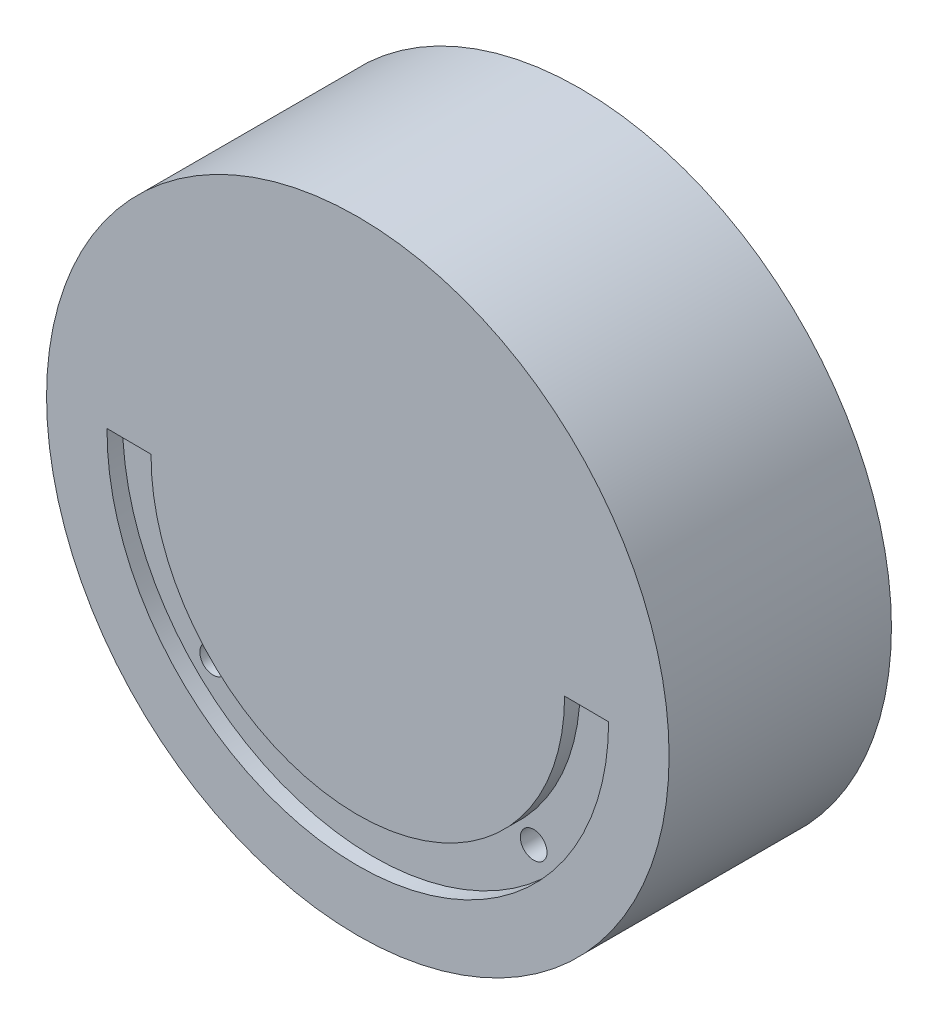
ISO-10303-21;
HEADER;
FILE_DESCRIPTION(('STEP AP214'),'2;1');
FILE_NAME('part.step','',(''),(''),'','','');
FILE_SCHEMA(('AUTOMOTIVE_DESIGN { 1 0 10303 214 1 1 1 1 }'));
ENDSEC;
DATA;
#1=APPLICATION_CONTEXT('core data for automotive mechanical design processes');
#2=APPLICATION_PROTOCOL_DEFINITION('international standard','automotive_design',2000,#1);
#3=PRODUCT_CONTEXT('',#1,'mechanical');
#4=PRODUCT('Part','Part','',(#3));
#5=PRODUCT_RELATED_PRODUCT_CATEGORY('part','',(#4));
#6=PRODUCT_DEFINITION_FORMATION('','',#4);
#7=PRODUCT_DEFINITION_CONTEXT('part definition',#1,'design');
#8=PRODUCT_DEFINITION('design','',#6,#7);
#9=PRODUCT_DEFINITION_SHAPE('','',#8);
#10=(LENGTH_UNIT() NAMED_UNIT(*) SI_UNIT(.MILLI.,.METRE.));
#11=(NAMED_UNIT(*) PLANE_ANGLE_UNIT() SI_UNIT($,.RADIAN.));
#12=(NAMED_UNIT(*) SI_UNIT($,.STERADIAN.) SOLID_ANGLE_UNIT());
#13=UNCERTAINTY_MEASURE_WITH_UNIT(LENGTH_MEASURE(1.E-05),#10,'distance_accuracy_value','');
#14=(GEOMETRIC_REPRESENTATION_CONTEXT(3) GLOBAL_UNCERTAINTY_ASSIGNED_CONTEXT((#13)) GLOBAL_UNIT_ASSIGNED_CONTEXT((#10,
#11,#12)) REPRESENTATION_CONTEXT('',''));
#15=CARTESIAN_POINT('',(0.,0.,0.));
#16=DIRECTION('',(0.,0.,1.));
#17=DIRECTION('',(1.,0.,0.));
#18=AXIS2_PLACEMENT_3D('',#15,#16,#17);
#19=CARTESIAN_POINT('',(0.,0.,50.));
#20=DIRECTION('',(0.,0.,-1.));
#21=DIRECTION('',(-1.,0.,0.));
#22=AXIS2_PLACEMENT_3D('',#19,#20,#21);
#23=CYLINDRICAL_SURFACE('',#22,70.);
#24=CARTESIAN_POINT('',(0.,0.,50.));
#25=DIRECTION('',(0.,0.,1.));
#26=DIRECTION('',(1.,0.,0.));
#27=AXIS2_PLACEMENT_3D('',#24,#25,#26);
#28=CIRCLE('',#27,70.);
#29=CARTESIAN_POINT('',(70.,0.,50.));
#30=VERTEX_POINT('',#29);
#31=EDGE_CURVE('E11',#30,#30,#28,.T.);
#32=ORIENTED_EDGE('',*,*,#31,.F.);
#33=EDGE_LOOP('',(#32));
#34=FACE_BOUND('',#33,.T.);
#35=CARTESIAN_POINT('',(0.,0.,0.));
#36=DIRECTION('',(0.,0.,1.));
#37=DIRECTION('',(1.,0.,0.));
#38=AXIS2_PLACEMENT_3D('',#35,#36,#37);
#39=CIRCLE('',#38,70.);
#40=CARTESIAN_POINT('',(70.,0.,0.));
#41=VERTEX_POINT('',#40);
#42=EDGE_CURVE('E36',#41,#41,#39,.T.);
#43=ORIENTED_EDGE('',*,*,#42,.T.);
#44=EDGE_LOOP('',(#43));
#45=FACE_BOUND('',#44,.T.);
#46=ADVANCED_FACE('F33',(#34,#45),#23,.T.);
#47=CARTESIAN_POINT('',(0.,0.,50.));
#48=DIRECTION('',(0.,0.,1.));
#49=DIRECTION('',(1.,0.,0.));
#50=AXIS2_PLACEMENT_3D('',#47,#48,#49);
#51=PLANE('',#50);
#52=CARTESIAN_POINT('',(0.,0.,50.));
#53=DIRECTION('',(0.,0.,-1.));
#54=DIRECTION('',(1.,0.,0.));
#55=AXIS2_PLACEMENT_3D('',#52,#53,#54);
#56=CIRCLE('',#55,46.5);
#57=CARTESIAN_POINT('',(46.4998912888105,-0.100549136287969,50.));
#58=VERTEX_POINT('',#57);
#59=CARTESIAN_POINT('',(-46.4973059319187,0.500540781112885,50.));
#60=VERTEX_POINT('',#59);
#61=EDGE_CURVE('E47',#58,#60,#56,.T.);
#62=ORIENTED_EDGE('',*,*,#61,.F.);
#63=DIRECTION('',(-0.999979112062292,0.00646339222939639,0.));
#64=VECTOR('',#63,1.);
#65=CARTESIAN_POINT('',(46.4998912888105,-0.100549136287969,50.));
#66=LINE('',#65,#64);
#67=CARTESIAN_POINT('',(56.3997599951223,-0.164537207335236,50.));
#68=VERTEX_POINT('',#67);
#69=EDGE_CURVE('E98',#68,#58,#66,.T.);
#70=ORIENTED_EDGE('',*,*,#69,.F.);
#71=CARTESIAN_POINT('',(0.,0.,50.));
#72=DIRECTION('',(0.,0.,1.));
#73=DIRECTION('',(1.,0.,0.));
#74=AXIS2_PLACEMENT_3D('',#71,#72,#73);
#75=CIRCLE('',#74,56.4);
#76=CARTESIAN_POINT('',(-56.3971746382306,0.564528852160148,50.));
#77=VERTEX_POINT('',#76);
#78=EDGE_CURVE('E106',#77,#68,#75,.T.);
#79=ORIENTED_EDGE('',*,*,#78,.F.);
#80=DIRECTION('',(-0.999979112062292,0.00646339222939639,0.));
#81=VECTOR('',#80,1.);
#82=CARTESIAN_POINT('',(-56.3971746382306,0.564528852160148,50.));
#83=LINE('',#82,#81);
#84=EDGE_CURVE('E82',#60,#77,#83,.T.);
#85=ORIENTED_EDGE('',*,*,#84,.F.);
#86=EDGE_LOOP('',(#62,#70,#79,#85));
#87=FACE_BOUND('',#86,.T.);
#88=ORIENTED_EDGE('',*,*,#31,.T.);
#89=EDGE_LOOP('',(#88));
#90=FACE_BOUND('',#89,.T.);
#91=ADVANCED_FACE('F112',(#87,#90),#51,.T.);
#92=CARTESIAN_POINT('',(0.,0.,0.));
#93=DIRECTION('',(0.,0.,1.));
#94=DIRECTION('',(1.,0.,0.));
#95=AXIS2_PLACEMENT_3D('',#92,#93,#94);
#96=PLANE('',#95);
#97=ORIENTED_EDGE('',*,*,#42,.F.);
#98=EDGE_LOOP('',(#97));
#99=FACE_BOUND('',#98,.T.);
#100=ADVANCED_FACE('F124',(#99),#96,.F.);
#101=CARTESIAN_POINT('',(0.,0.,46.5));
#102=DIRECTION('',(0.,0.,1.));
#103=DIRECTION('',(1.,0.,0.));
#104=AXIS2_PLACEMENT_3D('',#101,#102,#103);
#105=CYLINDRICAL_SURFACE('',#104,46.5);
#106=ORIENTED_EDGE('',*,*,#61,.T.);
#107=DIRECTION('',(0.,0.,1.));
#108=VECTOR('',#107,1.);
#109=CARTESIAN_POINT('',(-46.4973059319187,0.500540781112885,46.5));
#110=LINE('',#109,#108);
#111=CARTESIAN_POINT('',(-46.4973059319187,0.500540781112885,46.5));
#112=VERTEX_POINT('',#111);
#113=EDGE_CURVE('E70',#112,#60,#110,.T.);
#114=ORIENTED_EDGE('',*,*,#113,.F.);
#115=CARTESIAN_POINT('',(0.,0.,46.5));
#116=DIRECTION('',(0.,0.,-1.));
#117=DIRECTION('',(1.,0.,0.));
#118=AXIS2_PLACEMENT_3D('',#115,#116,#117);
#119=CIRCLE('',#118,46.5);
#120=CARTESIAN_POINT('',(46.4998912888105,-0.100549136287969,46.5));
#121=VERTEX_POINT('',#120);
#122=EDGE_CURVE('E96',#121,#112,#119,.T.);
#123=ORIENTED_EDGE('',*,*,#122,.F.);
#124=DIRECTION('',(0.,0.,1.));
#125=VECTOR('',#124,1.);
#126=CARTESIAN_POINT('',(46.4998912888105,-0.100549136287969,46.5));
#127=LINE('',#126,#125);
#128=EDGE_CURVE('E55',#121,#58,#127,.T.);
#129=ORIENTED_EDGE('',*,*,#128,.T.);
#130=EDGE_LOOP('',(#106,#114,#123,#129));
#131=FACE_BOUND('',#130,.T.);
#132=ADVANCED_FACE('F117',(#131),#105,.T.);
#133=CARTESIAN_POINT('',(46.4998912888105,-0.100549136287969,46.5));
#134=DIRECTION('',(0.00646339222939639,0.999979112062292,0.));
#135=DIRECTION('',(-0.999979112062292,0.00646339222939639,0.));
#136=AXIS2_PLACEMENT_3D('',#133,#134,#135);
#137=PLANE('',#136);
#138=ORIENTED_EDGE('',*,*,#69,.T.);
#139=ORIENTED_EDGE('',*,*,#128,.F.);
#140=DIRECTION('',(-0.999979112062292,0.00646339222939639,0.));
#141=VECTOR('',#140,1.);
#142=CARTESIAN_POINT('',(46.4998912888105,-0.100549136287969,46.5));
#143=LINE('',#142,#141);
#144=CARTESIAN_POINT('',(56.3997599951223,-0.164537207335236,46.5));
#145=VERTEX_POINT('',#144);
#146=EDGE_CURVE('E93',#145,#121,#143,.T.);
#147=ORIENTED_EDGE('',*,*,#146,.F.);
#148=DIRECTION('',(0.,0.,1.));
#149=VECTOR('',#148,1.);
#150=CARTESIAN_POINT('',(56.3997599951223,-0.164537207335236,46.5));
#151=LINE('',#150,#149);
#152=EDGE_CURVE('E86',#145,#68,#151,.T.);
#153=ORIENTED_EDGE('',*,*,#152,.T.);
#154=EDGE_LOOP('',(#138,#139,#147,#153));
#155=FACE_BOUND('',#154,.T.);
#156=ADVANCED_FACE('F115',(#155),#137,.F.);
#157=CARTESIAN_POINT('',(0.,0.,46.5));
#158=DIRECTION('',(0.,0.,1.));
#159=DIRECTION('',(1.,0.,0.));
#160=AXIS2_PLACEMENT_3D('',#157,#158,#159);
#161=CYLINDRICAL_SURFACE('',#160,56.4);
#162=ORIENTED_EDGE('',*,*,#78,.T.);
#163=ORIENTED_EDGE('',*,*,#152,.F.);
#164=CARTESIAN_POINT('',(0.,0.,46.5));
#165=DIRECTION('',(0.,0.,1.));
#166=DIRECTION('',(1.,0.,0.));
#167=AXIS2_PLACEMENT_3D('',#164,#165,#166);
#168=CIRCLE('',#167,56.4);
#169=CARTESIAN_POINT('',(-56.3971746382306,0.564528852160148,46.5));
#170=VERTEX_POINT('',#169);
#171=EDGE_CURVE('E89',#170,#145,#168,.T.);
#172=ORIENTED_EDGE('',*,*,#171,.F.);
#173=DIRECTION('',(0.,0.,1.));
#174=VECTOR('',#173,1.);
#175=CARTESIAN_POINT('',(-56.3971746382306,0.564528852160148,46.5));
#176=LINE('',#175,#174);
#177=EDGE_CURVE('E75',#170,#77,#176,.T.);
#178=ORIENTED_EDGE('',*,*,#177,.T.);
#179=EDGE_LOOP('',(#162,#163,#172,#178));
#180=FACE_BOUND('',#179,.T.);
#181=ADVANCED_FACE('F90',(#180),#161,.F.);
#182=CARTESIAN_POINT('',(-56.3971746382306,0.564528852160148,46.5));
#183=DIRECTION('',(0.00646339222939639,0.999979112062292,0.));
#184=DIRECTION('',(-0.999979112062292,0.00646339222939639,0.));
#185=AXIS2_PLACEMENT_3D('',#182,#183,#184);
#186=PLANE('',#185);
#187=ORIENTED_EDGE('',*,*,#84,.T.);
#188=ORIENTED_EDGE('',*,*,#177,.F.);
#189=DIRECTION('',(-0.999979112062292,0.00646339222939639,0.));
#190=VECTOR('',#189,1.);
#191=CARTESIAN_POINT('',(-56.3971746382306,0.564528852160148,46.5));
#192=LINE('',#191,#190);
#193=EDGE_CURVE('E79',#112,#170,#192,.T.);
#194=ORIENTED_EDGE('',*,*,#193,.F.);
#195=ORIENTED_EDGE('',*,*,#113,.T.);
#196=EDGE_LOOP('',(#187,#188,#194,#195));
#197=FACE_BOUND('',#196,.T.);
#198=ADVANCED_FACE('F77',(#197),#186,.F.);
#199=CARTESIAN_POINT('',(0.,0.,46.5));
#200=DIRECTION('',(0.,0.,1.));
#201=DIRECTION('',(1.,0.,0.));
#202=AXIS2_PLACEMENT_3D('',#199,#200,#201);
#203=PLANE('',#202);
#204=CARTESIAN_POINT('',(36.0401152511962,-36.0401152511961,46.5));
#205=DIRECTION('',(0.,0.,1.));
#206=DIRECTION('',(-1.,0.,0.));
#207=AXIS2_PLACEMENT_3D('',#204,#205,#206);
#208=CIRCLE('',#207,3.);
#209=CARTESIAN_POINT('',(33.0401152511962,-36.0401152511961,46.5));
#210=VERTEX_POINT('',#209);
#211=EDGE_CURVE('E173',#210,#210,#208,.T.);
#212=ORIENTED_EDGE('',*,*,#211,.F.);
#213=EDGE_LOOP('',(#212));
#214=FACE_BOUND('',#213,.T.);
#215=CARTESIAN_POINT('',(-36.0401152511962,-36.0401152511961,46.5));
#216=DIRECTION('',(0.,0.,1.));
#217=DIRECTION('',(1.,0.,0.));
#218=AXIS2_PLACEMENT_3D('',#215,#216,#217);
#219=CIRCLE('',#218,3.);
#220=CARTESIAN_POINT('',(-33.0401152511962,-36.0401152511961,46.5));
#221=VERTEX_POINT('',#220);
#222=EDGE_CURVE('E172',#221,#221,#219,.T.);
#223=ORIENTED_EDGE('',*,*,#222,.F.);
#224=EDGE_LOOP('',(#223));
#225=FACE_BOUND('',#224,.T.);
#226=ORIENTED_EDGE('',*,*,#122,.T.);
#227=ORIENTED_EDGE('',*,*,#193,.T.);
#228=ORIENTED_EDGE('',*,*,#171,.T.);
#229=ORIENTED_EDGE('',*,*,#146,.T.);
#230=EDGE_LOOP('',(#226,#227,#228,#229));
#231=FACE_BOUND('',#230,.T.);
#232=ADVANCED_FACE('F95',(#214,#225,#231),#203,.T.);
#233=CARTESIAN_POINT('',(-36.0401152511962,-36.0401152511961,40.5));
#234=DIRECTION('',(0.,0.,1.));
#235=DIRECTION('',(1.,0.,0.));
#236=AXIS2_PLACEMENT_3D('',#233,#234,#235);
#237=CYLINDRICAL_SURFACE('',#236,3.);
#238=CARTESIAN_POINT('',(-36.0401152511962,-36.0401152511961,40.5));
#239=DIRECTION('',(0.,0.,1.));
#240=DIRECTION('',(1.,0.,0.));
#241=AXIS2_PLACEMENT_3D('',#238,#239,#240);
#242=CIRCLE('',#241,3.);
#243=CARTESIAN_POINT('',(-33.0401152511962,-36.0401152511961,40.5));
#244=VERTEX_POINT('',#243);
#245=EDGE_CURVE('E104',#244,#244,#242,.T.);
#246=ORIENTED_EDGE('',*,*,#245,.F.);
#247=EDGE_LOOP('',(#246));
#248=FACE_BOUND('',#247,.T.);
#249=ORIENTED_EDGE('',*,*,#222,.T.);
#250=EDGE_LOOP('',(#249));
#251=FACE_BOUND('',#250,.T.);
#252=ADVANCED_FACE('F146',(#248,#251),#237,.F.);
#253=CARTESIAN_POINT('',(-36.0401152511962,-36.0401152511961,40.5));
#254=DIRECTION('',(0.,0.,1.));
#255=DIRECTION('',(1.,0.,0.));
#256=AXIS2_PLACEMENT_3D('',#253,#254,#255);
#257=PLANE('',#256);
#258=ORIENTED_EDGE('',*,*,#245,.T.);
#259=EDGE_LOOP('',(#258));
#260=FACE_BOUND('',#259,.T.);
#261=ADVANCED_FACE('F151',(#260),#257,.T.);
#262=CARTESIAN_POINT('',(36.0401152511962,-36.0401152511961,40.5));
#263=DIRECTION('',(0.,0.,1.));
#264=DIRECTION('',(1.,0.,0.));
#265=AXIS2_PLACEMENT_3D('',#262,#263,#264);
#266=CYLINDRICAL_SURFACE('',#265,3.);
#267=CARTESIAN_POINT('',(36.0401152511962,-36.0401152511961,40.5));
#268=DIRECTION('',(0.,0.,1.));
#269=DIRECTION('',(-1.,0.,0.));
#270=AXIS2_PLACEMENT_3D('',#267,#268,#269);
#271=CIRCLE('',#270,3.);
#272=CARTESIAN_POINT('',(33.0401152511962,-36.0401152511961,40.5));
#273=VERTEX_POINT('',#272);
#274=EDGE_CURVE('E171',#273,#273,#271,.T.);
#275=ORIENTED_EDGE('',*,*,#274,.F.);
#276=EDGE_LOOP('',(#275));
#277=FACE_BOUND('',#276,.T.);
#278=ORIENTED_EDGE('',*,*,#211,.T.);
#279=EDGE_LOOP('',(#278));
#280=FACE_BOUND('',#279,.T.);
#281=ADVANCED_FACE('F159',(#277,#280),#266,.F.);
#282=CARTESIAN_POINT('',(36.0401152511962,-36.0401152511961,40.5));
#283=DIRECTION('',(0.,0.,-1.));
#284=DIRECTION('',(-1.,0.,0.));
#285=AXIS2_PLACEMENT_3D('',#282,#283,#284);
#286=PLANE('',#285);
#287=ORIENTED_EDGE('',*,*,#274,.T.);
#288=EDGE_LOOP('',(#287));
#289=FACE_BOUND('',#288,.T.);
#290=ADVANCED_FACE('F163',(#289),#286,.F.);
#291=CLOSED_SHELL('',(#46,#91,#100,#132,#156,#181,#198,#232,#252,#261,#281,#290));
#292=MANIFOLD_SOLID_BREP('B2',#291);
#293=ADVANCED_BREP_SHAPE_REPRESENTATION('',(#18,#292),#14);
#294=SHAPE_DEFINITION_REPRESENTATION(#9,#293);
ENDSEC;
END-ISO-10303-21;
